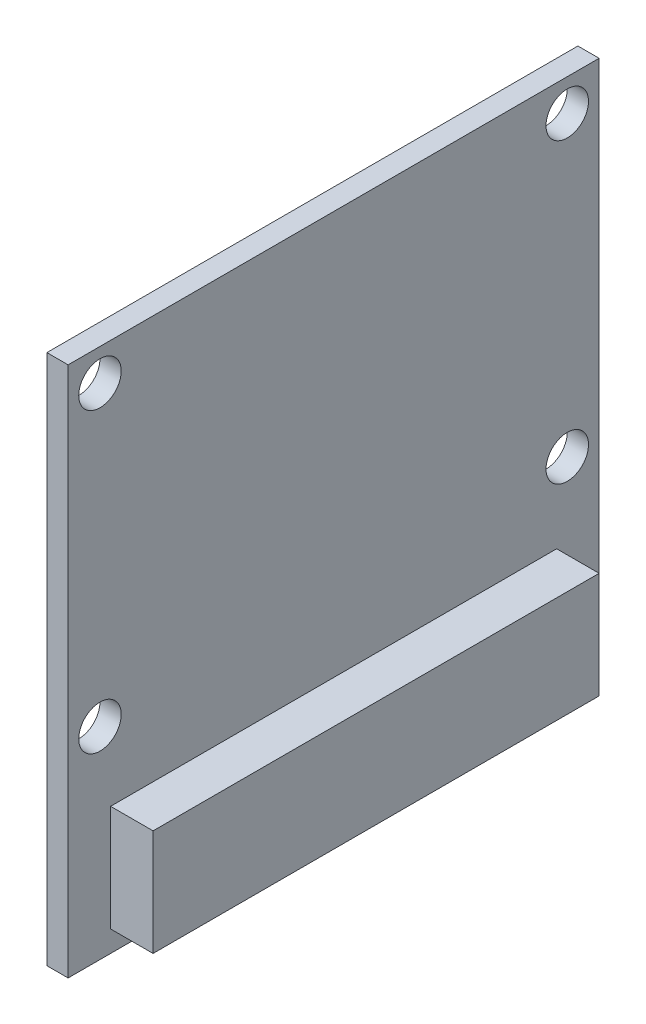
ISO-10303-21;
HEADER;
FILE_DESCRIPTION(('STEP AP214'),'2;1');
FILE_NAME('part.step','',(''),(''),'','','');
FILE_SCHEMA(('AUTOMOTIVE_DESIGN { 1 0 10303 214 1 1 1 1 }'));
ENDSEC;
DATA;
#1=APPLICATION_CONTEXT('core data for automotive mechanical design processes');
#2=APPLICATION_PROTOCOL_DEFINITION('international standard','automotive_design',2000,#1);
#3=PRODUCT_CONTEXT('',#1,'mechanical');
#4=PRODUCT('Part','Part','',(#3));
#5=PRODUCT_RELATED_PRODUCT_CATEGORY('part','',(#4));
#6=PRODUCT_DEFINITION_FORMATION('','',#4);
#7=PRODUCT_DEFINITION_CONTEXT('part definition',#1,'design');
#8=PRODUCT_DEFINITION('design','',#6,#7);
#9=PRODUCT_DEFINITION_SHAPE('','',#8);
#10=(LENGTH_UNIT() NAMED_UNIT(*) SI_UNIT(.MILLI.,.METRE.));
#11=(NAMED_UNIT(*) PLANE_ANGLE_UNIT() SI_UNIT($,.RADIAN.));
#12=(NAMED_UNIT(*) SI_UNIT($,.STERADIAN.) SOLID_ANGLE_UNIT());
#13=UNCERTAINTY_MEASURE_WITH_UNIT(LENGTH_MEASURE(1.E-05),#10,'distance_accuracy_value','');
#14=(GEOMETRIC_REPRESENTATION_CONTEXT(3) GLOBAL_UNCERTAINTY_ASSIGNED_CONTEXT((#13)) GLOBAL_UNIT_ASSIGNED_CONTEXT((#10,
#11,#12)) REPRESENTATION_CONTEXT('',''));
#15=CARTESIAN_POINT('',(0.,0.,0.));
#16=DIRECTION('',(0.,0.,1.));
#17=DIRECTION('',(1.,0.,0.));
#18=AXIS2_PLACEMENT_3D('',#15,#16,#17);
#19=CARTESIAN_POINT('',(0.,0.,0.));
#20=DIRECTION('',(-1.,0.,0.));
#21=DIRECTION('',(0.,0.,1.));
#22=AXIS2_PLACEMENT_3D('',#19,#20,#21);
#23=PLANE('',#22);
#24=CARTESIAN_POINT('',(0.,9.5,-23.5));
#25=DIRECTION('',(-1.,0.,0.));
#26=DIRECTION('',(0.,0.,1.));
#27=AXIS2_PLACEMENT_3D('',#24,#25,#26);
#28=CIRCLE('',#27,1.);
#29=CARTESIAN_POINT('',(0.,9.5,-22.5));
#30=VERTEX_POINT('',#29);
#31=EDGE_CURVE('E590',#30,#30,#28,.T.);
#32=ORIENTED_EDGE('',*,*,#31,.F.);
#33=EDGE_LOOP('',(#32));
#34=FACE_BOUND('',#33,.T.);
#35=CARTESIAN_POINT('',(0.,9.5,-1.5));
#36=DIRECTION('',(-1.,0.,0.));
#37=DIRECTION('',(0.,0.,1.));
#38=AXIS2_PLACEMENT_3D('',#35,#36,#37);
#39=CIRCLE('',#38,1.);
#40=CARTESIAN_POINT('',(0.,9.5,-0.499999999999997));
#41=VERTEX_POINT('',#40);
#42=EDGE_CURVE('E592',#41,#41,#39,.T.);
#43=ORIENTED_EDGE('',*,*,#42,.F.);
#44=EDGE_LOOP('',(#43));
#45=FACE_BOUND('',#44,.T.);
#46=CARTESIAN_POINT('',(0.,23.5,-1.5));
#47=DIRECTION('',(-1.,0.,0.));
#48=DIRECTION('',(0.,0.,1.));
#49=AXIS2_PLACEMENT_3D('',#46,#47,#48);
#50=CIRCLE('',#49,1.);
#51=CARTESIAN_POINT('',(0.,23.5,-0.500000000000001));
#52=VERTEX_POINT('',#51);
#53=EDGE_CURVE('E664',#52,#52,#50,.T.);
#54=ORIENTED_EDGE('',*,*,#53,.F.);
#55=EDGE_LOOP('',(#54));
#56=FACE_BOUND('',#55,.T.);
#57=CARTESIAN_POINT('',(0.,23.5,-23.5));
#58=DIRECTION('',(-1.,0.,0.));
#59=DIRECTION('',(0.,0.,1.));
#60=AXIS2_PLACEMENT_3D('',#57,#58,#59);
#61=CIRCLE('',#60,1.);
#62=CARTESIAN_POINT('',(0.,23.5,-22.5));
#63=VERTEX_POINT('',#62);
#64=EDGE_CURVE('E599',#63,#63,#61,.T.);
#65=ORIENTED_EDGE('',*,*,#64,.F.);
#66=EDGE_LOOP('',(#65));
#67=FACE_BOUND('',#66,.T.);
#68=DIRECTION('',(0.,1.,0.));
#69=VECTOR('',#68,1.);
#70=CARTESIAN_POINT('',(0.,0.,0.));
#71=LINE('',#70,#69);
#72=CARTESIAN_POINT('',(0.,0.,0.));
#73=VERTEX_POINT('',#72);
#74=CARTESIAN_POINT('',(0.,25.,0.));
#75=VERTEX_POINT('',#74);
#76=EDGE_CURVE('E267',#73,#75,#71,.T.);
#77=ORIENTED_EDGE('',*,*,#76,.T.);
#78=DIRECTION('',(0.,0.,-1.));
#79=VECTOR('',#78,1.);
#80=CARTESIAN_POINT('',(0.,25.,0.));
#81=LINE('',#80,#79);
#82=CARTESIAN_POINT('',(0.,25.,-25.));
#83=VERTEX_POINT('',#82);
#84=EDGE_CURVE('E281',#75,#83,#81,.T.);
#85=ORIENTED_EDGE('',*,*,#84,.T.);
#86=DIRECTION('',(0.,1.,0.));
#87=VECTOR('',#86,1.);
#88=CARTESIAN_POINT('',(0.,0.,-25.));
#89=LINE('',#88,#87);
#90=CARTESIAN_POINT('',(0.,0.,-25.));
#91=VERTEX_POINT('',#90);
#92=EDGE_CURVE('E284',#91,#83,#89,.T.);
#93=ORIENTED_EDGE('',*,*,#92,.F.);
#94=DIRECTION('',(0.,0.,-1.));
#95=VECTOR('',#94,1.);
#96=CARTESIAN_POINT('',(0.,0.,0.));
#97=LINE('',#96,#95);
#98=EDGE_CURVE('E272',#73,#91,#97,.T.);
#99=ORIENTED_EDGE('',*,*,#98,.F.);
#100=EDGE_LOOP('',(#77,#85,#93,#99));
#101=FACE_BOUND('',#100,.T.);
#102=DIRECTION('',(0.,0.,-1.));
#103=VECTOR('',#102,1.);
#104=CARTESIAN_POINT('',(0.,14.,-16.5));
#105=LINE('',#104,#103);
#106=CARTESIAN_POINT('',(0.,14.,-15.));
#107=VERTEX_POINT('',#106);
#108=CARTESIAN_POINT('',(0.,14.,-16.5));
#109=VERTEX_POINT('',#108);
#110=EDGE_CURVE('E219',#107,#109,#105,.T.);
#111=ORIENTED_EDGE('',*,*,#110,.F.);
#112=DIRECTION('',(0.,-1.,0.));
#113=VECTOR('',#112,1.);
#114=CARTESIAN_POINT('',(0.,19.3638666422937,-15.));
#115=LINE('',#114,#113);
#116=CARTESIAN_POINT('',(0.,19.3638666422937,-15.));
#117=VERTEX_POINT('',#116);
#118=EDGE_CURVE('E617',#117,#107,#115,.T.);
#119=ORIENTED_EDGE('',*,*,#118,.F.);
#120=DIRECTION('',(0.,0.,1.));
#121=VECTOR('',#120,1.);
#122=CARTESIAN_POINT('',(0.,19.3638666422937,-16.));
#123=LINE('',#122,#121);
#124=CARTESIAN_POINT('',(0.,19.3638666422937,-16.));
#125=VERTEX_POINT('',#124);
#126=EDGE_CURVE('E615',#125,#117,#123,.T.);
#127=ORIENTED_EDGE('',*,*,#126,.F.);
#128=DIRECTION('',(0.,-1.,0.));
#129=VECTOR('',#128,1.);
#130=CARTESIAN_POINT('',(0.,23.3638666422937,-16.));
#131=LINE('',#130,#129);
#132=CARTESIAN_POINT('',(0.,23.3638666422937,-16.));
#133=VERTEX_POINT('',#132);
#134=EDGE_CURVE('E196',#133,#125,#131,.T.);
#135=ORIENTED_EDGE('',*,*,#134,.F.);
#136=DIRECTION('',(0.,0.,-1.));
#137=VECTOR('',#136,1.);
#138=CARTESIAN_POINT('',(0.,23.3638666422937,-16.));
#139=LINE('',#138,#137);
#140=CARTESIAN_POINT('',(0.,23.3638666422937,-9.));
#141=VERTEX_POINT('',#140);
#142=EDGE_CURVE('E192',#141,#133,#139,.T.);
#143=ORIENTED_EDGE('',*,*,#142,.F.);
#144=DIRECTION('',(0.,1.,0.));
#145=VECTOR('',#144,1.);
#146=CARTESIAN_POINT('',(0.,23.3638666422937,-9.));
#147=LINE('',#146,#145);
#148=CARTESIAN_POINT('',(0.,19.3638666422937,-9.));
#149=VERTEX_POINT('',#148);
#150=EDGE_CURVE('E623',#149,#141,#147,.T.);
#151=ORIENTED_EDGE('',*,*,#150,.F.);
#152=DIRECTION('',(0.,0.,1.));
#153=VECTOR('',#152,1.);
#154=CARTESIAN_POINT('',(0.,19.3638666422937,-10.));
#155=LINE('',#154,#153);
#156=CARTESIAN_POINT('',(0.,19.3638666422937,-10.));
#157=VERTEX_POINT('',#156);
#158=EDGE_CURVE('E621',#157,#149,#155,.T.);
#159=ORIENTED_EDGE('',*,*,#158,.F.);
#160=DIRECTION('',(0.,1.,0.));
#161=VECTOR('',#160,1.);
#162=CARTESIAN_POINT('',(0.,19.3638666422937,-10.));
#163=LINE('',#162,#161);
#164=CARTESIAN_POINT('',(0.,14.,-10.));
#165=VERTEX_POINT('',#164);
#166=EDGE_CURVE('E619',#165,#157,#163,.T.);
#167=ORIENTED_EDGE('',*,*,#166,.F.);
#168=CARTESIAN_POINT('',(0.,14.,-8.5));
#169=VERTEX_POINT('',#168);
#170=EDGE_CURVE('E220',#169,#165,#105,.T.);
#171=ORIENTED_EDGE('',*,*,#170,.F.);
#172=DIRECTION('',(0.,1.,0.));
#173=VECTOR('',#172,1.);
#174=CARTESIAN_POINT('',(0.,14.,-8.5));
#175=LINE('',#174,#173);
#176=CARTESIAN_POINT('',(0.,6.,-8.5));
#177=VERTEX_POINT('',#176);
#178=EDGE_CURVE('E201',#177,#169,#175,.T.);
#179=ORIENTED_EDGE('',*,*,#178,.F.);
#180=DIRECTION('',(0.,0.,1.));
#181=VECTOR('',#180,1.);
#182=CARTESIAN_POINT('',(0.,6.,-16.5));
#183=LINE('',#182,#181);
#184=CARTESIAN_POINT('',(0.,6.,-16.5));
#185=VERTEX_POINT('',#184);
#186=EDGE_CURVE('E210',#185,#177,#183,.T.);
#187=ORIENTED_EDGE('',*,*,#186,.F.);
#188=DIRECTION('',(0.,-1.,0.));
#189=VECTOR('',#188,1.);
#190=CARTESIAN_POINT('',(0.,14.,-16.5));
#191=LINE('',#190,#189);
#192=EDGE_CURVE('E223',#109,#185,#191,.T.);
#193=ORIENTED_EDGE('',*,*,#192,.F.);
#194=EDGE_LOOP('',(#111,#119,#127,#135,#143,#151,#159,#167,#171,#179,#187,#193));
#195=FACE_BOUND('',#194,.T.);
#196=ADVANCED_FACE('F33',(#34,#45,#56,#67,#101,#195),#23,.T.);
#197=CARTESIAN_POINT('',(-2.,14.,-16.5));
#198=DIRECTION('',(0.,-1.,0.));
#199=DIRECTION('',(0.,0.,-1.));
#200=AXIS2_PLACEMENT_3D('',#197,#198,#199);
#201=PLANE('',#200);
#202=DIRECTION('',(1.,0.,0.));
#203=VECTOR('',#202,1.);
#204=CARTESIAN_POINT('',(-1.,14.,-15.));
#205=LINE('',#204,#203);
#206=CARTESIAN_POINT('',(-1.,14.,-15.));
#207=VERTEX_POINT('',#206);
#208=EDGE_CURVE('E50',#207,#107,#205,.T.);
#209=ORIENTED_EDGE('',*,*,#208,.T.);
#210=ORIENTED_EDGE('',*,*,#110,.T.);
#211=DIRECTION('',(1.,0.,0.));
#212=VECTOR('',#211,1.);
#213=CARTESIAN_POINT('',(-2.,14.,-16.5));
#214=LINE('',#213,#212);
#215=CARTESIAN_POINT('',(-2.,14.,-16.5));
#216=VERTEX_POINT('',#215);
#217=EDGE_CURVE('E229',#216,#109,#214,.T.);
#218=ORIENTED_EDGE('',*,*,#217,.F.);
#219=DIRECTION('',(0.,0.,-1.));
#220=VECTOR('',#219,1.);
#221=CARTESIAN_POINT('',(-2.,14.,-16.5));
#222=LINE('',#221,#220);
#223=CARTESIAN_POINT('',(-2.,14.,-8.5));
#224=VERTEX_POINT('',#223);
#225=EDGE_CURVE('E209',#224,#216,#222,.T.);
#226=ORIENTED_EDGE('',*,*,#225,.F.);
#227=DIRECTION('',(1.,0.,0.));
#228=VECTOR('',#227,1.);
#229=CARTESIAN_POINT('',(-2.,14.,-8.5));
#230=LINE('',#229,#228);
#231=EDGE_CURVE('E232',#224,#169,#230,.T.);
#232=ORIENTED_EDGE('',*,*,#231,.T.);
#233=ORIENTED_EDGE('',*,*,#170,.T.);
#234=DIRECTION('',(1.,0.,0.));
#235=VECTOR('',#234,1.);
#236=CARTESIAN_POINT('',(-1.,14.,-10.));
#237=LINE('',#236,#235);
#238=CARTESIAN_POINT('',(-1.,14.,-10.));
#239=VERTEX_POINT('',#238);
#240=EDGE_CURVE('E636',#239,#165,#237,.T.);
#241=ORIENTED_EDGE('',*,*,#240,.F.);
#242=DIRECTION('',(0.,0.,1.));
#243=VECTOR('',#242,1.);
#244=CARTESIAN_POINT('',(-1.,14.,-15.));
#245=LINE('',#244,#243);
#246=EDGE_CURVE('E604',#207,#239,#245,.T.);
#247=ORIENTED_EDGE('',*,*,#246,.F.);
#248=EDGE_LOOP('',(#209,#210,#218,#226,#232,#233,#241,#247));
#249=FACE_BOUND('',#248,.T.);
#250=ADVANCED_FACE('F315',(#249),#201,.F.);
#251=CARTESIAN_POINT('',(1.,0.,0.));
#252=DIRECTION('',(-1.,0.,0.));
#253=DIRECTION('',(0.,0.,1.));
#254=AXIS2_PLACEMENT_3D('',#251,#252,#253);
#255=PLANE('',#254);
#256=CARTESIAN_POINT('',(1.,9.5,-23.5));
#257=DIRECTION('',(-1.,0.,0.));
#258=DIRECTION('',(0.,0.,1.));
#259=AXIS2_PLACEMENT_3D('',#256,#257,#258);
#260=CIRCLE('',#259,1.);
#261=CARTESIAN_POINT('',(1.,9.5,-22.5));
#262=VERTEX_POINT('',#261);
#263=EDGE_CURVE('E588',#262,#262,#260,.T.);
#264=ORIENTED_EDGE('',*,*,#263,.T.);
#265=EDGE_LOOP('',(#264));
#266=FACE_BOUND('',#265,.T.);
#267=CARTESIAN_POINT('',(1.,9.5,-1.5));
#268=DIRECTION('',(-1.,0.,0.));
#269=DIRECTION('',(0.,0.,1.));
#270=AXIS2_PLACEMENT_3D('',#267,#268,#269);
#271=CIRCLE('',#270,1.);
#272=CARTESIAN_POINT('',(1.,9.5,-0.499999999999997));
#273=VERTEX_POINT('',#272);
#274=EDGE_CURVE('E669',#273,#273,#271,.T.);
#275=ORIENTED_EDGE('',*,*,#274,.T.);
#276=EDGE_LOOP('',(#275));
#277=FACE_BOUND('',#276,.T.);
#278=CARTESIAN_POINT('',(1.,23.5,-1.5));
#279=DIRECTION('',(-1.,0.,0.));
#280=DIRECTION('',(0.,0.,1.));
#281=AXIS2_PLACEMENT_3D('',#278,#279,#280);
#282=CIRCLE('',#281,1.);
#283=CARTESIAN_POINT('',(1.,23.5,-0.500000000000001));
#284=VERTEX_POINT('',#283);
#285=EDGE_CURVE('E601',#284,#284,#282,.T.);
#286=ORIENTED_EDGE('',*,*,#285,.T.);
#287=EDGE_LOOP('',(#286));
#288=FACE_BOUND('',#287,.T.);
#289=CARTESIAN_POINT('',(1.,23.5,-23.5));
#290=DIRECTION('',(-1.,0.,0.));
#291=DIRECTION('',(0.,0.,1.));
#292=AXIS2_PLACEMENT_3D('',#289,#290,#291);
#293=CIRCLE('',#292,1.);
#294=CARTESIAN_POINT('',(1.,23.5,-22.5));
#295=VERTEX_POINT('',#294);
#296=EDGE_CURVE('E596',#295,#295,#293,.T.);
#297=ORIENTED_EDGE('',*,*,#296,.T.);
#298=EDGE_LOOP('',(#297));
#299=FACE_BOUND('',#298,.T.);
#300=DIRECTION('',(0.,1.,0.));
#301=VECTOR('',#300,1.);
#302=CARTESIAN_POINT('',(1.,0.,0.));
#303=LINE('',#302,#301);
#304=CARTESIAN_POINT('',(1.,0.,0.));
#305=VERTEX_POINT('',#304);
#306=CARTESIAN_POINT('',(1.,25.,0.));
#307=VERTEX_POINT('',#306);
#308=EDGE_CURVE('E268',#305,#307,#303,.T.);
#309=ORIENTED_EDGE('',*,*,#308,.F.);
#310=DIRECTION('',(0.,0.,-1.));
#311=VECTOR('',#310,1.);
#312=CARTESIAN_POINT('',(1.,0.,0.));
#313=LINE('',#312,#311);
#314=CARTESIAN_POINT('',(1.,0.,-25.));
#315=VERTEX_POINT('',#314);
#316=EDGE_CURVE('E277',#305,#315,#313,.T.);
#317=ORIENTED_EDGE('',*,*,#316,.T.);
#318=DIRECTION('',(0.,1.,0.));
#319=VECTOR('',#318,1.);
#320=CARTESIAN_POINT('',(1.,0.,-25.));
#321=LINE('',#320,#319);
#322=CARTESIAN_POINT('',(1.,25.,-25.));
#323=VERTEX_POINT('',#322);
#324=EDGE_CURVE('E275',#315,#323,#321,.T.);
#325=ORIENTED_EDGE('',*,*,#324,.T.);
#326=DIRECTION('',(0.,0.,-1.));
#327=VECTOR('',#326,1.);
#328=CARTESIAN_POINT('',(1.,25.,0.));
#329=LINE('',#328,#327);
#330=EDGE_CURVE('E271',#307,#323,#329,.T.);
#331=ORIENTED_EDGE('',*,*,#330,.F.);
#332=EDGE_LOOP('',(#309,#317,#325,#331));
#333=FACE_BOUND('',#332,.T.);
#334=DIRECTION('',(0.,-1.,0.));
#335=VECTOR('',#334,1.);
#336=CARTESIAN_POINT('',(1.,6.,-2.));
#337=LINE('',#336,#335);
#338=CARTESIAN_POINT('',(1.,6.,-2.));
#339=VERTEX_POINT('',#338);
#340=CARTESIAN_POINT('',(1.,1.,-2.));
#341=VERTEX_POINT('',#340);
#342=EDGE_CURVE('E234',#339,#341,#337,.T.);
#343=ORIENTED_EDGE('',*,*,#342,.F.);
#344=DIRECTION('',(0.,0.,1.));
#345=VECTOR('',#344,1.);
#346=CARTESIAN_POINT('',(1.,6.,-2.));
#347=LINE('',#346,#345);
#348=CARTESIAN_POINT('',(1.,6.,-23.));
#349=VERTEX_POINT('',#348);
#350=EDGE_CURVE('E239',#349,#339,#347,.T.);
#351=ORIENTED_EDGE('',*,*,#350,.F.);
#352=DIRECTION('',(0.,1.,0.));
#353=VECTOR('',#352,1.);
#354=CARTESIAN_POINT('',(1.,6.,-23.));
#355=LINE('',#354,#353);
#356=CARTESIAN_POINT('',(1.,1.,-23.));
#357=VERTEX_POINT('',#356);
#358=EDGE_CURVE('E251',#357,#349,#355,.T.);
#359=ORIENTED_EDGE('',*,*,#358,.F.);
#360=DIRECTION('',(0.,0.,-1.));
#361=VECTOR('',#360,1.);
#362=CARTESIAN_POINT('',(1.,1.,-2.));
#363=LINE('',#362,#361);
#364=EDGE_CURVE('E248',#341,#357,#363,.T.);
#365=ORIENTED_EDGE('',*,*,#364,.F.);
#366=EDGE_LOOP('',(#343,#351,#359,#365));
#367=FACE_BOUND('',#366,.T.);
#368=ADVANCED_FACE('F312',(#266,#277,#288,#299,#333,#367),#255,.F.);
#369=CARTESIAN_POINT('',(1.,0.,0.));
#370=DIRECTION('',(0.,0.,1.));
#371=DIRECTION('',(1.,0.,0.));
#372=AXIS2_PLACEMENT_3D('',#369,#370,#371);
#373=PLANE('',#372);
#374=ORIENTED_EDGE('',*,*,#76,.F.);
#375=DIRECTION('',(-1.,0.,0.));
#376=VECTOR('',#375,1.);
#377=CARTESIAN_POINT('',(1.,0.,0.));
#378=LINE('',#377,#376);
#379=EDGE_CURVE('E42',#305,#73,#378,.T.);
#380=ORIENTED_EDGE('',*,*,#379,.F.);
#381=ORIENTED_EDGE('',*,*,#308,.T.);
#382=DIRECTION('',(-1.,0.,0.));
#383=VECTOR('',#382,1.);
#384=CARTESIAN_POINT('',(1.,25.,0.));
#385=LINE('',#384,#383);
#386=EDGE_CURVE('E37',#307,#75,#385,.T.);
#387=ORIENTED_EDGE('',*,*,#386,.T.);
#388=EDGE_LOOP('',(#374,#380,#381,#387));
#389=FACE_BOUND('',#388,.T.);
#390=ADVANCED_FACE('F35',(#389),#373,.T.);
#391=CARTESIAN_POINT('',(1.,0.,0.));
#392=DIRECTION('',(0.,1.,0.));
#393=DIRECTION('',(0.,0.,1.));
#394=AXIS2_PLACEMENT_3D('',#391,#392,#393);
#395=PLANE('',#394);
#396=ORIENTED_EDGE('',*,*,#98,.T.);
#397=DIRECTION('',(-1.,0.,0.));
#398=VECTOR('',#397,1.);
#399=CARTESIAN_POINT('',(1.,0.,-25.));
#400=LINE('',#399,#398);
#401=EDGE_CURVE('E289',#315,#91,#400,.T.);
#402=ORIENTED_EDGE('',*,*,#401,.F.);
#403=ORIENTED_EDGE('',*,*,#316,.F.);
#404=ORIENTED_EDGE('',*,*,#379,.T.);
#405=EDGE_LOOP('',(#396,#402,#403,#404));
#406=FACE_BOUND('',#405,.T.);
#407=ADVANCED_FACE('F306',(#406),#395,.F.);
#408=CARTESIAN_POINT('',(1.,0.,-25.));
#409=DIRECTION('',(0.,0.,1.));
#410=DIRECTION('',(1.,0.,0.));
#411=AXIS2_PLACEMENT_3D('',#408,#409,#410);
#412=PLANE('',#411);
#413=ORIENTED_EDGE('',*,*,#92,.T.);
#414=DIRECTION('',(-1.,0.,0.));
#415=VECTOR('',#414,1.);
#416=CARTESIAN_POINT('',(1.,25.,-25.));
#417=LINE('',#416,#415);
#418=EDGE_CURVE('E291',#323,#83,#417,.T.);
#419=ORIENTED_EDGE('',*,*,#418,.F.);
#420=ORIENTED_EDGE('',*,*,#324,.F.);
#421=ORIENTED_EDGE('',*,*,#401,.T.);
#422=EDGE_LOOP('',(#413,#419,#420,#421));
#423=FACE_BOUND('',#422,.T.);
#424=ADVANCED_FACE('F310',(#423),#412,.F.);
#425=CARTESIAN_POINT('',(1.,25.,0.));
#426=DIRECTION('',(0.,1.,0.));
#427=DIRECTION('',(0.,0.,1.));
#428=AXIS2_PLACEMENT_3D('',#425,#426,#427);
#429=PLANE('',#428);
#430=ORIENTED_EDGE('',*,*,#84,.F.);
#431=ORIENTED_EDGE('',*,*,#386,.F.);
#432=ORIENTED_EDGE('',*,*,#330,.T.);
#433=ORIENTED_EDGE('',*,*,#418,.T.);
#434=EDGE_LOOP('',(#430,#431,#432,#433));
#435=FACE_BOUND('',#434,.T.);
#436=ADVANCED_FACE('F299',(#435),#429,.T.);
#437=CARTESIAN_POINT('',(3.,6.,-2.));
#438=DIRECTION('',(0.,0.,-1.));
#439=DIRECTION('',(0.,1.,0.));
#440=AXIS2_PLACEMENT_3D('',#437,#438,#439);
#441=PLANE('',#440);
#442=ORIENTED_EDGE('',*,*,#342,.T.);
#443=DIRECTION('',(-1.,0.,0.));
#444=VECTOR('',#443,1.);
#445=CARTESIAN_POINT('',(3.,1.,-2.));
#446=LINE('',#445,#444);
#447=CARTESIAN_POINT('',(3.,1.,-2.));
#448=VERTEX_POINT('',#447);
#449=EDGE_CURVE('E264',#448,#341,#446,.T.);
#450=ORIENTED_EDGE('',*,*,#449,.F.);
#451=DIRECTION('',(0.,-1.,0.));
#452=VECTOR('',#451,1.);
#453=CARTESIAN_POINT('',(3.,6.,-2.));
#454=LINE('',#453,#452);
#455=CARTESIAN_POINT('',(3.,6.,-2.));
#456=VERTEX_POINT('',#455);
#457=EDGE_CURVE('E235',#456,#448,#454,.T.);
#458=ORIENTED_EDGE('',*,*,#457,.F.);
#459=DIRECTION('',(-1.,0.,0.));
#460=VECTOR('',#459,1.);
#461=CARTESIAN_POINT('',(3.,6.,-2.));
#462=LINE('',#461,#460);
#463=EDGE_CURVE('E245',#456,#339,#462,.T.);
#464=ORIENTED_EDGE('',*,*,#463,.T.);
#465=EDGE_LOOP('',(#442,#450,#458,#464));
#466=FACE_BOUND('',#465,.T.);
#467=ADVANCED_FACE('F326',(#466),#441,.F.);
#468=CARTESIAN_POINT('',(3.,1.,-2.));
#469=DIRECTION('',(0.,1.,0.));
#470=DIRECTION('',(0.,0.,1.));
#471=AXIS2_PLACEMENT_3D('',#468,#469,#470);
#472=PLANE('',#471);
#473=ORIENTED_EDGE('',*,*,#364,.T.);
#474=DIRECTION('',(-1.,0.,0.));
#475=VECTOR('',#474,1.);
#476=CARTESIAN_POINT('',(3.,1.,-23.));
#477=LINE('',#476,#475);
#478=CARTESIAN_POINT('',(3.,1.,-23.));
#479=VERTEX_POINT('',#478);
#480=EDGE_CURVE('E261',#479,#357,#477,.T.);
#481=ORIENTED_EDGE('',*,*,#480,.F.);
#482=DIRECTION('',(0.,0.,-1.));
#483=VECTOR('',#482,1.);
#484=CARTESIAN_POINT('',(3.,1.,-2.));
#485=LINE('',#484,#483);
#486=EDGE_CURVE('E238',#448,#479,#485,.T.);
#487=ORIENTED_EDGE('',*,*,#486,.F.);
#488=ORIENTED_EDGE('',*,*,#449,.T.);
#489=EDGE_LOOP('',(#473,#481,#487,#488));
#490=FACE_BOUND('',#489,.T.);
#491=ADVANCED_FACE('F334',(#490),#472,.F.);
#492=CARTESIAN_POINT('',(3.,6.,-23.));
#493=DIRECTION('',(0.,0.,1.));
#494=DIRECTION('',(1.,0.,0.));
#495=AXIS2_PLACEMENT_3D('',#492,#493,#494);
#496=PLANE('',#495);
#497=ORIENTED_EDGE('',*,*,#358,.T.);
#498=DIRECTION('',(-1.,0.,0.));
#499=VECTOR('',#498,1.);
#500=CARTESIAN_POINT('',(3.,6.,-23.));
#501=LINE('',#500,#499);
#502=CARTESIAN_POINT('',(3.,6.,-23.));
#503=VERTEX_POINT('',#502);
#504=EDGE_CURVE('E258',#503,#349,#501,.T.);
#505=ORIENTED_EDGE('',*,*,#504,.F.);
#506=DIRECTION('',(0.,1.,0.));
#507=VECTOR('',#506,1.);
#508=CARTESIAN_POINT('',(3.,6.,-23.));
#509=LINE('',#508,#507);
#510=EDGE_CURVE('E241',#479,#503,#509,.T.);
#511=ORIENTED_EDGE('',*,*,#510,.F.);
#512=ORIENTED_EDGE('',*,*,#480,.T.);
#513=EDGE_LOOP('',(#497,#505,#511,#512));
#514=FACE_BOUND('',#513,.T.);
#515=ADVANCED_FACE('F332',(#514),#496,.F.);
#516=CARTESIAN_POINT('',(3.,6.,-2.));
#517=DIRECTION('',(0.,-1.,0.));
#518=DIRECTION('',(0.,0.,-1.));
#519=AXIS2_PLACEMENT_3D('',#516,#517,#518);
#520=PLANE('',#519);
#521=ORIENTED_EDGE('',*,*,#350,.T.);
#522=ORIENTED_EDGE('',*,*,#463,.F.);
#523=DIRECTION('',(0.,0.,1.));
#524=VECTOR('',#523,1.);
#525=CARTESIAN_POINT('',(3.,6.,-2.));
#526=LINE('',#525,#524);
#527=EDGE_CURVE('E243',#503,#456,#526,.T.);
#528=ORIENTED_EDGE('',*,*,#527,.F.);
#529=ORIENTED_EDGE('',*,*,#504,.T.);
#530=EDGE_LOOP('',(#521,#522,#528,#529));
#531=FACE_BOUND('',#530,.T.);
#532=ADVANCED_FACE('F322',(#531),#520,.F.);
#533=CARTESIAN_POINT('',(3.,0.,0.));
#534=DIRECTION('',(1.,0.,0.));
#535=DIRECTION('',(0.,0.,-1.));
#536=AXIS2_PLACEMENT_3D('',#533,#534,#535);
#537=PLANE('',#536);
#538=ORIENTED_EDGE('',*,*,#457,.T.);
#539=ORIENTED_EDGE('',*,*,#486,.T.);
#540=ORIENTED_EDGE('',*,*,#510,.T.);
#541=ORIENTED_EDGE('',*,*,#527,.T.);
#542=EDGE_LOOP('',(#538,#539,#540,#541));
#543=FACE_BOUND('',#542,.T.);
#544=ADVANCED_FACE('F328',(#543),#537,.T.);
#545=CARTESIAN_POINT('',(-2.,14.,-8.5));
#546=DIRECTION('',(0.,0.,-1.));
#547=DIRECTION('',(0.,1.,0.));
#548=AXIS2_PLACEMENT_3D('',#545,#546,#547);
#549=PLANE('',#548);
#550=ORIENTED_EDGE('',*,*,#178,.T.);
#551=ORIENTED_EDGE('',*,*,#231,.F.);
#552=DIRECTION('',(0.,1.,0.));
#553=VECTOR('',#552,1.);
#554=CARTESIAN_POINT('',(-2.,14.,-8.5));
#555=LINE('',#554,#553);
#556=CARTESIAN_POINT('',(-2.,6.,-8.5));
#557=VERTEX_POINT('',#556);
#558=EDGE_CURVE('E206',#557,#224,#555,.T.);
#559=ORIENTED_EDGE('',*,*,#558,.F.);
#560=DIRECTION('',(1.,0.,0.));
#561=VECTOR('',#560,1.);
#562=CARTESIAN_POINT('',(-2.,6.,-8.5));
#563=LINE('',#562,#561);
#564=EDGE_CURVE('E216',#557,#177,#563,.T.);
#565=ORIENTED_EDGE('',*,*,#564,.T.);
#566=EDGE_LOOP('',(#550,#551,#559,#565));
#567=FACE_BOUND('',#566,.T.);
#568=ADVANCED_FACE('F394',(#567),#549,.F.);
#569=CARTESIAN_POINT('',(-2.,14.,-16.5));
#570=DIRECTION('',(0.,0.,1.));
#571=DIRECTION('',(0.,-1.,0.));
#572=AXIS2_PLACEMENT_3D('',#569,#570,#571);
#573=PLANE('',#572);
#574=ORIENTED_EDGE('',*,*,#192,.T.);
#575=DIRECTION('',(1.,0.,0.));
#576=VECTOR('',#575,1.);
#577=CARTESIAN_POINT('',(-2.,6.,-16.5));
#578=LINE('',#577,#576);
#579=CARTESIAN_POINT('',(-2.,6.,-16.5));
#580=VERTEX_POINT('',#579);
#581=EDGE_CURVE('E58',#580,#185,#578,.T.);
#582=ORIENTED_EDGE('',*,*,#581,.F.);
#583=DIRECTION('',(0.,-1.,0.));
#584=VECTOR('',#583,1.);
#585=CARTESIAN_POINT('',(-2.,14.,-16.5));
#586=LINE('',#585,#584);
#587=EDGE_CURVE('E212',#216,#580,#586,.T.);
#588=ORIENTED_EDGE('',*,*,#587,.F.);
#589=ORIENTED_EDGE('',*,*,#217,.T.);
#590=EDGE_LOOP('',(#574,#582,#588,#589));
#591=FACE_BOUND('',#590,.T.);
#592=ADVANCED_FACE('F403',(#591),#573,.F.);
#593=CARTESIAN_POINT('',(-2.,6.,-16.5));
#594=DIRECTION('',(0.,1.,0.));
#595=DIRECTION('',(0.,0.,1.));
#596=AXIS2_PLACEMENT_3D('',#593,#594,#595);
#597=PLANE('',#596);
#598=ORIENTED_EDGE('',*,*,#186,.T.);
#599=ORIENTED_EDGE('',*,*,#564,.F.);
#600=DIRECTION('',(0.,0.,1.));
#601=VECTOR('',#600,1.);
#602=CARTESIAN_POINT('',(-2.,6.,-16.5));
#603=LINE('',#602,#601);
#604=EDGE_CURVE('E214',#580,#557,#603,.T.);
#605=ORIENTED_EDGE('',*,*,#604,.F.);
#606=ORIENTED_EDGE('',*,*,#581,.T.);
#607=EDGE_LOOP('',(#598,#599,#605,#606));
#608=FACE_BOUND('',#607,.T.);
#609=ADVANCED_FACE('F413',(#608),#597,.F.);
#610=CARTESIAN_POINT('',(-2.,0.,0.));
#611=DIRECTION('',(-1.,0.,0.));
#612=DIRECTION('',(0.,0.,1.));
#613=AXIS2_PLACEMENT_3D('',#610,#611,#612);
#614=PLANE('',#613);
#615=CARTESIAN_POINT('',(-2.,10.,-12.5));
#616=DIRECTION('',(-1.,0.,0.));
#617=DIRECTION('',(0.,0.,1.));
#618=AXIS2_PLACEMENT_3D('',#615,#616,#617);
#619=CIRCLE('',#618,3.5);
#620=CARTESIAN_POINT('',(-2.,10.,-9.));
#621=VERTEX_POINT('',#620);
#622=EDGE_CURVE('E11',#621,#621,#619,.T.);
#623=ORIENTED_EDGE('',*,*,#622,.F.);
#624=EDGE_LOOP('',(#623));
#625=FACE_BOUND('',#624,.T.);
#626=ORIENTED_EDGE('',*,*,#558,.T.);
#627=ORIENTED_EDGE('',*,*,#225,.T.);
#628=ORIENTED_EDGE('',*,*,#587,.T.);
#629=ORIENTED_EDGE('',*,*,#604,.T.);
#630=EDGE_LOOP('',(#626,#627,#628,#629));
#631=FACE_BOUND('',#630,.T.);
#632=ADVANCED_FACE('F423',(#625,#631),#614,.T.);
#633=CARTESIAN_POINT('',(-3.,10.,-12.5));
#634=DIRECTION('',(1.,0.,0.));
#635=DIRECTION('',(0.,0.,-1.));
#636=AXIS2_PLACEMENT_3D('',#633,#634,#635);
#637=CYLINDRICAL_SURFACE('',#636,3.5);
#638=CARTESIAN_POINT('',(-3.,10.,-12.5));
#639=DIRECTION('',(-1.,0.,0.));
#640=DIRECTION('',(0.,0.,1.));
#641=AXIS2_PLACEMENT_3D('',#638,#639,#640);
#642=CIRCLE('',#641,3.5);
#643=CARTESIAN_POINT('',(-3.,10.,-9.));
#644=VERTEX_POINT('',#643);
#645=EDGE_CURVE('E198',#644,#644,#642,.T.);
#646=ORIENTED_EDGE('',*,*,#645,.F.);
#647=EDGE_LOOP('',(#646));
#648=FACE_BOUND('',#647,.T.);
#649=ORIENTED_EDGE('',*,*,#622,.T.);
#650=EDGE_LOOP('',(#649));
#651=FACE_BOUND('',#650,.T.);
#652=ADVANCED_FACE('F432',(#648,#651),#637,.T.);
#653=CARTESIAN_POINT('',(-3.,10.,-12.5));
#654=DIRECTION('',(-1.,0.,0.));
#655=DIRECTION('',(0.,0.,1.));
#656=AXIS2_PLACEMENT_3D('',#653,#654,#655);
#657=PLANE('',#656);
#658=ORIENTED_EDGE('',*,*,#645,.T.);
#659=EDGE_LOOP('',(#658));
#660=FACE_BOUND('',#659,.T.);
#661=ADVANCED_FACE('F442',(#660),#657,.T.);
#662=CARTESIAN_POINT('',(-1.,23.3638666422937,-16.));
#663=DIRECTION('',(0.,0.,1.));
#664=DIRECTION('',(0.,-1.,0.));
#665=AXIS2_PLACEMENT_3D('',#662,#663,#664);
#666=PLANE('',#665);
#667=ORIENTED_EDGE('',*,*,#134,.T.);
#668=DIRECTION('',(1.,0.,0.));
#669=VECTOR('',#668,1.);
#670=CARTESIAN_POINT('',(-1.,19.3638666422937,-16.));
#671=LINE('',#670,#669);
#672=CARTESIAN_POINT('',(-1.,19.3638666422937,-16.));
#673=VERTEX_POINT('',#672);
#674=EDGE_CURVE('E177',#673,#125,#671,.T.);
#675=ORIENTED_EDGE('',*,*,#674,.F.);
#676=DIRECTION('',(0.,-1.,0.));
#677=VECTOR('',#676,1.);
#678=CARTESIAN_POINT('',(-1.,23.3638666422937,-16.));
#679=LINE('',#678,#677);
#680=CARTESIAN_POINT('',(-1.,23.3638666422937,-16.));
#681=VERTEX_POINT('',#680);
#682=EDGE_CURVE('E183',#681,#673,#679,.T.);
#683=ORIENTED_EDGE('',*,*,#682,.F.);
#684=DIRECTION('',(1.,0.,0.));
#685=VECTOR('',#684,1.);
#686=CARTESIAN_POINT('',(-1.,23.3638666422937,-16.));
#687=LINE('',#686,#685);
#688=EDGE_CURVE('E613',#681,#133,#687,.T.);
#689=ORIENTED_EDGE('',*,*,#688,.T.);
#690=EDGE_LOOP('',(#667,#675,#683,#689));
#691=FACE_BOUND('',#690,.T.);
#692=ADVANCED_FACE('F194',(#691),#666,.F.);
#693=CARTESIAN_POINT('',(-1.,19.3638666422937,-16.));
#694=DIRECTION('',(0.,1.,0.));
#695=DIRECTION('',(0.,0.,1.));
#696=AXIS2_PLACEMENT_3D('',#693,#694,#695);
#697=PLANE('',#696);
#698=ORIENTED_EDGE('',*,*,#126,.T.);
#699=DIRECTION('',(1.,0.,0.));
#700=VECTOR('',#699,1.);
#701=CARTESIAN_POINT('',(-1.,19.3638666422937,-15.));
#702=LINE('',#701,#700);
#703=CARTESIAN_POINT('',(-1.,19.3638666422937,-15.));
#704=VERTEX_POINT('',#703);
#705=EDGE_CURVE('E180',#704,#117,#702,.T.);
#706=ORIENTED_EDGE('',*,*,#705,.F.);
#707=DIRECTION('',(0.,0.,1.));
#708=VECTOR('',#707,1.);
#709=CARTESIAN_POINT('',(-1.,19.3638666422937,-16.));
#710=LINE('',#709,#708);
#711=EDGE_CURVE('E173',#673,#704,#710,.T.);
#712=ORIENTED_EDGE('',*,*,#711,.F.);
#713=ORIENTED_EDGE('',*,*,#674,.T.);
#714=EDGE_LOOP('',(#698,#706,#712,#713));
#715=FACE_BOUND('',#714,.T.);
#716=ADVANCED_FACE('F175',(#715),#697,.F.);
#717=CARTESIAN_POINT('',(-1.,19.3638666422937,-15.));
#718=DIRECTION('',(0.,0.,1.));
#719=DIRECTION('',(1.,0.,0.));
#720=AXIS2_PLACEMENT_3D('',#717,#718,#719);
#721=PLANE('',#720);
#722=ORIENTED_EDGE('',*,*,#118,.T.);
#723=ORIENTED_EDGE('',*,*,#208,.F.);
#724=DIRECTION('',(0.,-1.,0.));
#725=VECTOR('',#724,1.);
#726=CARTESIAN_POINT('',(-1.,19.3638666422937,-15.));
#727=LINE('',#726,#725);
#728=EDGE_CURVE('E182',#704,#207,#727,.T.);
#729=ORIENTED_EDGE('',*,*,#728,.F.);
#730=ORIENTED_EDGE('',*,*,#705,.T.);
#731=EDGE_LOOP('',(#722,#723,#729,#730));
#732=FACE_BOUND('',#731,.T.);
#733=ADVANCED_FACE('F476',(#732),#721,.F.);
#734=CARTESIAN_POINT('',(-1.,19.3638666422937,-10.));
#735=DIRECTION('',(0.,0.,-1.));
#736=DIRECTION('',(-1.,0.,0.));
#737=AXIS2_PLACEMENT_3D('',#734,#735,#736);
#738=PLANE('',#737);
#739=ORIENTED_EDGE('',*,*,#166,.T.);
#740=DIRECTION('',(1.,0.,0.));
#741=VECTOR('',#740,1.);
#742=CARTESIAN_POINT('',(-1.,19.3638666422937,-10.));
#743=LINE('',#742,#741);
#744=CARTESIAN_POINT('',(-1.,19.3638666422937,-10.));
#745=VERTEX_POINT('',#744);
#746=EDGE_CURVE('E633',#745,#157,#743,.T.);
#747=ORIENTED_EDGE('',*,*,#746,.F.);
#748=DIRECTION('',(0.,1.,0.));
#749=VECTOR('',#748,1.);
#750=CARTESIAN_POINT('',(-1.,19.3638666422937,-10.));
#751=LINE('',#750,#749);
#752=EDGE_CURVE('E606',#239,#745,#751,.T.);
#753=ORIENTED_EDGE('',*,*,#752,.F.);
#754=ORIENTED_EDGE('',*,*,#240,.T.);
#755=EDGE_LOOP('',(#739,#747,#753,#754));
#756=FACE_BOUND('',#755,.T.);
#757=ADVANCED_FACE('F485',(#756),#738,.F.);
#758=CARTESIAN_POINT('',(-1.,19.3638666422937,-10.));
#759=DIRECTION('',(0.,1.,0.));
#760=DIRECTION('',(0.,0.,1.));
#761=AXIS2_PLACEMENT_3D('',#758,#759,#760);
#762=PLANE('',#761);
#763=ORIENTED_EDGE('',*,*,#158,.T.);
#764=DIRECTION('',(1.,0.,0.));
#765=VECTOR('',#764,1.);
#766=CARTESIAN_POINT('',(-1.,19.3638666422937,-9.));
#767=LINE('',#766,#765);
#768=CARTESIAN_POINT('',(-1.,19.3638666422937,-9.));
#769=VERTEX_POINT('',#768);
#770=EDGE_CURVE('E630',#769,#149,#767,.T.);
#771=ORIENTED_EDGE('',*,*,#770,.F.);
#772=DIRECTION('',(0.,0.,1.));
#773=VECTOR('',#772,1.);
#774=CARTESIAN_POINT('',(-1.,19.3638666422937,-10.));
#775=LINE('',#774,#773);
#776=EDGE_CURVE('E608',#745,#769,#775,.T.);
#777=ORIENTED_EDGE('',*,*,#776,.F.);
#778=ORIENTED_EDGE('',*,*,#746,.T.);
#779=EDGE_LOOP('',(#763,#771,#777,#778));
#780=FACE_BOUND('',#779,.T.);
#781=ADVANCED_FACE('F494',(#780),#762,.F.);
#782=CARTESIAN_POINT('',(-1.,23.3638666422937,-9.));
#783=DIRECTION('',(0.,0.,-1.));
#784=DIRECTION('',(0.,1.,0.));
#785=AXIS2_PLACEMENT_3D('',#782,#783,#784);
#786=PLANE('',#785);
#787=ORIENTED_EDGE('',*,*,#150,.T.);
#788=DIRECTION('',(1.,0.,0.));
#789=VECTOR('',#788,1.);
#790=CARTESIAN_POINT('',(-1.,23.3638666422937,-9.));
#791=LINE('',#790,#789);
#792=CARTESIAN_POINT('',(-1.,23.3638666422937,-9.));
#793=VERTEX_POINT('',#792);
#794=EDGE_CURVE('E627',#793,#141,#791,.T.);
#795=ORIENTED_EDGE('',*,*,#794,.F.);
#796=DIRECTION('',(0.,1.,0.));
#797=VECTOR('',#796,1.);
#798=CARTESIAN_POINT('',(-1.,23.3638666422937,-9.));
#799=LINE('',#798,#797);
#800=EDGE_CURVE('E610',#769,#793,#799,.T.);
#801=ORIENTED_EDGE('',*,*,#800,.F.);
#802=ORIENTED_EDGE('',*,*,#770,.T.);
#803=EDGE_LOOP('',(#787,#795,#801,#802));
#804=FACE_BOUND('',#803,.T.);
#805=ADVANCED_FACE('F504',(#804),#786,.F.);
#806=CARTESIAN_POINT('',(-1.,23.3638666422937,-16.));
#807=DIRECTION('',(0.,-1.,0.));
#808=DIRECTION('',(0.,0.,-1.));
#809=AXIS2_PLACEMENT_3D('',#806,#807,#808);
#810=PLANE('',#809);
#811=ORIENTED_EDGE('',*,*,#142,.T.);
#812=ORIENTED_EDGE('',*,*,#688,.F.);
#813=DIRECTION('',(0.,0.,-1.));
#814=VECTOR('',#813,1.);
#815=CARTESIAN_POINT('',(-1.,23.3638666422937,-16.));
#816=LINE('',#815,#814);
#817=EDGE_CURVE('E188',#793,#681,#816,.T.);
#818=ORIENTED_EDGE('',*,*,#817,.F.);
#819=ORIENTED_EDGE('',*,*,#794,.T.);
#820=EDGE_LOOP('',(#811,#812,#818,#819));
#821=FACE_BOUND('',#820,.T.);
#822=ADVANCED_FACE('F514',(#821),#810,.F.);
#823=CARTESIAN_POINT('',(-1.,0.,0.));
#824=DIRECTION('',(-1.,0.,0.));
#825=DIRECTION('',(0.,0.,1.));
#826=AXIS2_PLACEMENT_3D('',#823,#824,#825);
#827=PLANE('',#826);
#828=ORIENTED_EDGE('',*,*,#682,.T.);
#829=ORIENTED_EDGE('',*,*,#711,.T.);
#830=ORIENTED_EDGE('',*,*,#728,.T.);
#831=ORIENTED_EDGE('',*,*,#246,.T.);
#832=ORIENTED_EDGE('',*,*,#752,.T.);
#833=ORIENTED_EDGE('',*,*,#776,.T.);
#834=ORIENTED_EDGE('',*,*,#800,.T.);
#835=ORIENTED_EDGE('',*,*,#817,.T.);
#836=EDGE_LOOP('',(#828,#829,#830,#831,#832,#833,#834,#835));
#837=FACE_BOUND('',#836,.T.);
#838=ADVANCED_FACE('F186',(#837),#827,.T.);
#839=CARTESIAN_POINT('',(1.,23.5,-23.5));
#840=DIRECTION('',(-1.,0.,0.));
#841=DIRECTION('',(0.,0.,1.));
#842=AXIS2_PLACEMENT_3D('',#839,#840,#841);
#843=CYLINDRICAL_SURFACE('',#842,1.);
#844=ORIENTED_EDGE('',*,*,#296,.F.);
#845=EDGE_LOOP('',(#844));
#846=FACE_BOUND('',#845,.T.);
#847=ORIENTED_EDGE('',*,*,#64,.T.);
#848=EDGE_LOOP('',(#847));
#849=FACE_BOUND('',#848,.T.);
#850=ADVANCED_FACE('F532',(#846,#849),#843,.F.);
#851=CARTESIAN_POINT('',(1.,23.5,-1.5));
#852=DIRECTION('',(-1.,0.,0.));
#853=DIRECTION('',(0.,0.,1.));
#854=AXIS2_PLACEMENT_3D('',#851,#852,#853);
#855=CYLINDRICAL_SURFACE('',#854,1.);
#856=ORIENTED_EDGE('',*,*,#285,.F.);
#857=EDGE_LOOP('',(#856));
#858=FACE_BOUND('',#857,.T.);
#859=ORIENTED_EDGE('',*,*,#53,.T.);
#860=EDGE_LOOP('',(#859));
#861=FACE_BOUND('',#860,.T.);
#862=ADVANCED_FACE('F551',(#858,#861),#855,.F.);
#863=CARTESIAN_POINT('',(1.,9.5,-1.5));
#864=DIRECTION('',(-1.,0.,0.));
#865=DIRECTION('',(0.,0.,1.));
#866=AXIS2_PLACEMENT_3D('',#863,#864,#865);
#867=CYLINDRICAL_SURFACE('',#866,1.);
#868=ORIENTED_EDGE('',*,*,#274,.F.);
#869=EDGE_LOOP('',(#868));
#870=FACE_BOUND('',#869,.T.);
#871=ORIENTED_EDGE('',*,*,#42,.T.);
#872=EDGE_LOOP('',(#871));
#873=FACE_BOUND('',#872,.T.);
#874=ADVANCED_FACE('F561',(#870,#873),#867,.F.);
#875=CARTESIAN_POINT('',(1.,9.5,-23.5));
#876=DIRECTION('',(-1.,0.,0.));
#877=DIRECTION('',(0.,0.,1.));
#878=AXIS2_PLACEMENT_3D('',#875,#876,#877);
#879=CYLINDRICAL_SURFACE('',#878,1.);
#880=ORIENTED_EDGE('',*,*,#263,.F.);
#881=EDGE_LOOP('',(#880));
#882=FACE_BOUND('',#881,.T.);
#883=ORIENTED_EDGE('',*,*,#31,.T.);
#884=EDGE_LOOP('',(#883));
#885=FACE_BOUND('',#884,.T.);
#886=ADVANCED_FACE('F571',(#882,#885),#879,.F.);
#887=CLOSED_SHELL('',(#196,#250,#368,#390,#407,#424,#436,#467,#491,#515,#532,#544,#568,#592,
#609,#632,#652,#661,#692,#716,#733,#757,#781,#805,#822,#838,#850,#862,#874,#886));
#888=MANIFOLD_SOLID_BREP('B2',#887);
#889=ADVANCED_BREP_SHAPE_REPRESENTATION('',(#18,#888),#14);
#890=SHAPE_DEFINITION_REPRESENTATION(#9,#889);
ENDSEC;
END-ISO-10303-21;
